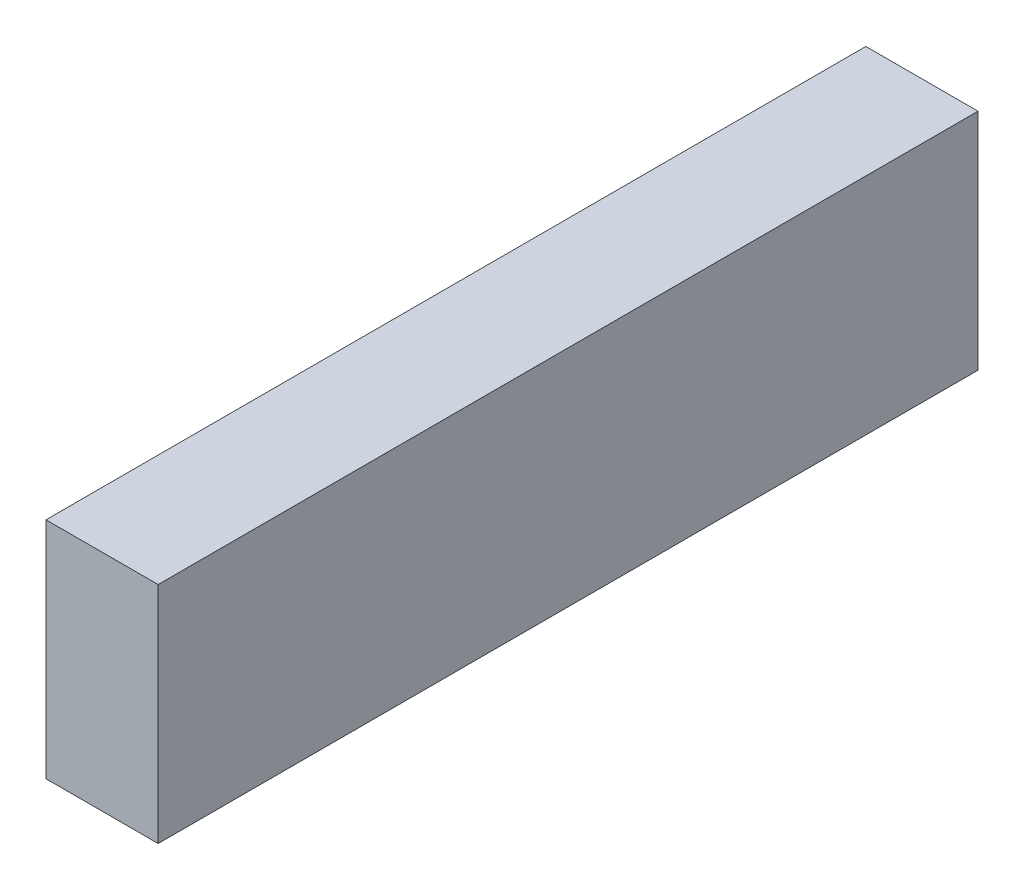
ISO-10303-21;
HEADER;
FILE_DESCRIPTION(('STEP AP214'),'2;1');
FILE_NAME('part.step','',(''),(''),'','','');
FILE_SCHEMA(('AUTOMOTIVE_DESIGN { 1 0 10303 214 1 1 1 1 }'));
ENDSEC;
DATA;
#1=APPLICATION_CONTEXT('core data for automotive mechanical design processes');
#2=APPLICATION_PROTOCOL_DEFINITION('international standard','automotive_design',2000,#1);
#3=PRODUCT_CONTEXT('',#1,'mechanical');
#4=PRODUCT('Part','Part','',(#3));
#5=PRODUCT_RELATED_PRODUCT_CATEGORY('part','',(#4));
#6=PRODUCT_DEFINITION_FORMATION('','',#4);
#7=PRODUCT_DEFINITION_CONTEXT('part definition',#1,'design');
#8=PRODUCT_DEFINITION('design','',#6,#7);
#9=PRODUCT_DEFINITION_SHAPE('','',#8);
#10=(LENGTH_UNIT() NAMED_UNIT(*) SI_UNIT(.MILLI.,.METRE.));
#11=(NAMED_UNIT(*) PLANE_ANGLE_UNIT() SI_UNIT($,.RADIAN.));
#12=(NAMED_UNIT(*) SI_UNIT($,.STERADIAN.) SOLID_ANGLE_UNIT());
#13=UNCERTAINTY_MEASURE_WITH_UNIT(LENGTH_MEASURE(1.E-05),#10,'distance_accuracy_value','');
#14=(GEOMETRIC_REPRESENTATION_CONTEXT(3) GLOBAL_UNCERTAINTY_ASSIGNED_CONTEXT((#13)) GLOBAL_UNIT_ASSIGNED_CONTEXT((#10,
#11,#12)) REPRESENTATION_CONTEXT('',''));
#15=CARTESIAN_POINT('',(0.,0.,0.));
#16=DIRECTION('',(0.,0.,1.));
#17=DIRECTION('',(1.,0.,0.));
#18=AXIS2_PLACEMENT_3D('',#15,#16,#17);
#19=CARTESIAN_POINT('',(10.,0.,0.));
#20=DIRECTION('',(0.,0.,-1.));
#21=DIRECTION('',(-1.,0.,0.));
#22=AXIS2_PLACEMENT_3D('',#19,#20,#21);
#23=PLANE('',#22);
#24=DIRECTION('',(0.,-1.,0.));
#25=VECTOR('',#24,1.);
#26=CARTESIAN_POINT('',(0.,0.,0.));
#27=LINE('',#26,#25);
#28=CARTESIAN_POINT('',(0.,20.,0.));
#29=VERTEX_POINT('',#28);
#30=CARTESIAN_POINT('',(0.,0.,0.));
#31=VERTEX_POINT('',#30);
#32=EDGE_CURVE('E106',#29,#31,#27,.T.);
#33=ORIENTED_EDGE('',*,*,#32,.T.);
#34=DIRECTION('',(-1.,0.,0.));
#35=VECTOR('',#34,1.);
#36=CARTESIAN_POINT('',(10.,0.,0.));
#37=LINE('',#36,#35);
#38=CARTESIAN_POINT('',(10.,0.,0.));
#39=VERTEX_POINT('',#38);
#40=EDGE_CURVE('E11',#39,#31,#37,.T.);
#41=ORIENTED_EDGE('',*,*,#40,.F.);
#42=DIRECTION('',(0.,-1.,0.));
#43=VECTOR('',#42,1.);
#44=CARTESIAN_POINT('',(10.,0.,0.));
#45=LINE('',#44,#43);
#46=CARTESIAN_POINT('',(10.,20.,0.));
#47=VERTEX_POINT('',#46);
#48=EDGE_CURVE('E92',#47,#39,#45,.T.);
#49=ORIENTED_EDGE('',*,*,#48,.F.);
#50=DIRECTION('',(-1.,0.,0.));
#51=VECTOR('',#50,1.);
#52=CARTESIAN_POINT('',(10.,20.,0.));
#53=LINE('',#52,#51);
#54=EDGE_CURVE('E105',#47,#29,#53,.T.);
#55=ORIENTED_EDGE('',*,*,#54,.T.);
#56=EDGE_LOOP('',(#33,#41,#49,#55));
#57=FACE_BOUND('',#56,.T.);
#58=ADVANCED_FACE('F43',(#57),#23,.F.);
#59=CARTESIAN_POINT('',(10.,0.,0.));
#60=DIRECTION('',(0.,1.,0.));
#61=DIRECTION('',(0.,0.,1.));
#62=AXIS2_PLACEMENT_3D('',#59,#60,#61);
#63=PLANE('',#62);
#64=DIRECTION('',(0.,0.,-1.));
#65=VECTOR('',#64,1.);
#66=CARTESIAN_POINT('',(0.,0.,0.));
#67=LINE('',#66,#65);
#68=CARTESIAN_POINT('',(0.,0.,-73.1));
#69=VERTEX_POINT('',#68);
#70=EDGE_CURVE('E97',#31,#69,#67,.T.);
#71=ORIENTED_EDGE('',*,*,#70,.T.);
#72=DIRECTION('',(-1.,0.,0.));
#73=VECTOR('',#72,1.);
#74=CARTESIAN_POINT('',(10.,0.,-73.1));
#75=LINE('',#74,#73);
#76=CARTESIAN_POINT('',(10.,0.,-73.1));
#77=VERTEX_POINT('',#76);
#78=EDGE_CURVE('E51',#77,#69,#75,.T.);
#79=ORIENTED_EDGE('',*,*,#78,.F.);
#80=DIRECTION('',(0.,0.,-1.));
#81=VECTOR('',#80,1.);
#82=CARTESIAN_POINT('',(10.,0.,0.));
#83=LINE('',#82,#81);
#84=EDGE_CURVE('E87',#39,#77,#83,.T.);
#85=ORIENTED_EDGE('',*,*,#84,.F.);
#86=ORIENTED_EDGE('',*,*,#40,.T.);
#87=EDGE_LOOP('',(#71,#79,#85,#86));
#88=FACE_BOUND('',#87,.T.);
#89=ADVANCED_FACE('F100',(#88),#63,.F.);
#90=CARTESIAN_POINT('',(10.,0.,-73.1));
#91=DIRECTION('',(0.,0.,1.));
#92=DIRECTION('',(1.,0.,0.));
#93=AXIS2_PLACEMENT_3D('',#90,#91,#92);
#94=PLANE('',#93);
#95=DIRECTION('',(0.,1.,0.));
#96=VECTOR('',#95,1.);
#97=CARTESIAN_POINT('',(0.,0.,-73.1));
#98=LINE('',#97,#96);
#99=CARTESIAN_POINT('',(0.,20.,-73.1));
#100=VERTEX_POINT('',#99);
#101=EDGE_CURVE('E78',#69,#100,#98,.T.);
#102=ORIENTED_EDGE('',*,*,#101,.T.);
#103=DIRECTION('',(-1.,0.,0.));
#104=VECTOR('',#103,1.);
#105=CARTESIAN_POINT('',(10.,20.,-73.1));
#106=LINE('',#105,#104);
#107=CARTESIAN_POINT('',(10.,20.,-73.1));
#108=VERTEX_POINT('',#107);
#109=EDGE_CURVE('E98',#108,#100,#106,.T.);
#110=ORIENTED_EDGE('',*,*,#109,.F.);
#111=DIRECTION('',(0.,1.,0.));
#112=VECTOR('',#111,1.);
#113=CARTESIAN_POINT('',(10.,0.,-73.1));
#114=LINE('',#113,#112);
#115=EDGE_CURVE('E95',#77,#108,#114,.T.);
#116=ORIENTED_EDGE('',*,*,#115,.F.);
#117=ORIENTED_EDGE('',*,*,#78,.T.);
#118=EDGE_LOOP('',(#102,#110,#116,#117));
#119=FACE_BOUND('',#118,.T.);
#120=ADVANCED_FACE('F99',(#119),#94,.F.);
#121=CARTESIAN_POINT('',(10.,20.,0.));
#122=DIRECTION('',(0.,-1.,0.));
#123=DIRECTION('',(0.,0.,-1.));
#124=AXIS2_PLACEMENT_3D('',#121,#122,#123);
#125=PLANE('',#124);
#126=DIRECTION('',(0.,0.,1.));
#127=VECTOR('',#126,1.);
#128=CARTESIAN_POINT('',(0.,20.,0.));
#129=LINE('',#128,#127);
#130=EDGE_CURVE('E85',#100,#29,#129,.T.);
#131=ORIENTED_EDGE('',*,*,#130,.T.);
#132=ORIENTED_EDGE('',*,*,#54,.F.);
#133=DIRECTION('',(0.,0.,1.));
#134=VECTOR('',#133,1.);
#135=CARTESIAN_POINT('',(10.,20.,0.));
#136=LINE('',#135,#134);
#137=EDGE_CURVE('E56',#108,#47,#136,.T.);
#138=ORIENTED_EDGE('',*,*,#137,.F.);
#139=ORIENTED_EDGE('',*,*,#109,.T.);
#140=EDGE_LOOP('',(#131,#132,#138,#139));
#141=FACE_BOUND('',#140,.T.);
#142=ADVANCED_FACE('F111',(#141),#125,.F.);
#143=CARTESIAN_POINT('',(10.,0.,0.));
#144=DIRECTION('',(-1.,0.,0.));
#145=DIRECTION('',(0.,0.,1.));
#146=AXIS2_PLACEMENT_3D('',#143,#144,#145);
#147=PLANE('',#146);
#148=ORIENTED_EDGE('',*,*,#48,.T.);
#149=ORIENTED_EDGE('',*,*,#84,.T.);
#150=ORIENTED_EDGE('',*,*,#115,.T.);
#151=ORIENTED_EDGE('',*,*,#137,.T.);
#152=EDGE_LOOP('',(#148,#149,#150,#151));
#153=FACE_BOUND('',#152,.T.);
#154=ADVANCED_FACE('F89',(#153),#147,.F.);
#155=CARTESIAN_POINT('',(0.,0.,0.));
#156=DIRECTION('',(-1.,0.,0.));
#157=DIRECTION('',(0.,0.,1.));
#158=AXIS2_PLACEMENT_3D('',#155,#156,#157);
#159=PLANE('',#158);
#160=ORIENTED_EDGE('',*,*,#32,.F.);
#161=ORIENTED_EDGE('',*,*,#130,.F.);
#162=ORIENTED_EDGE('',*,*,#101,.F.);
#163=ORIENTED_EDGE('',*,*,#70,.F.);
#164=EDGE_LOOP('',(#160,#161,#162,#163));
#165=FACE_BOUND('',#164,.T.);
#166=ADVANCED_FACE('F116',(#165),#159,.T.);
#167=CLOSED_SHELL('',(#58,#89,#120,#142,#154,#166));
#168=MANIFOLD_SOLID_BREP('B2',#167);
#169=ADVANCED_BREP_SHAPE_REPRESENTATION('',(#18,#168),#14);
#170=SHAPE_DEFINITION_REPRESENTATION(#9,#169);
ENDSEC;
END-ISO-10303-21;
